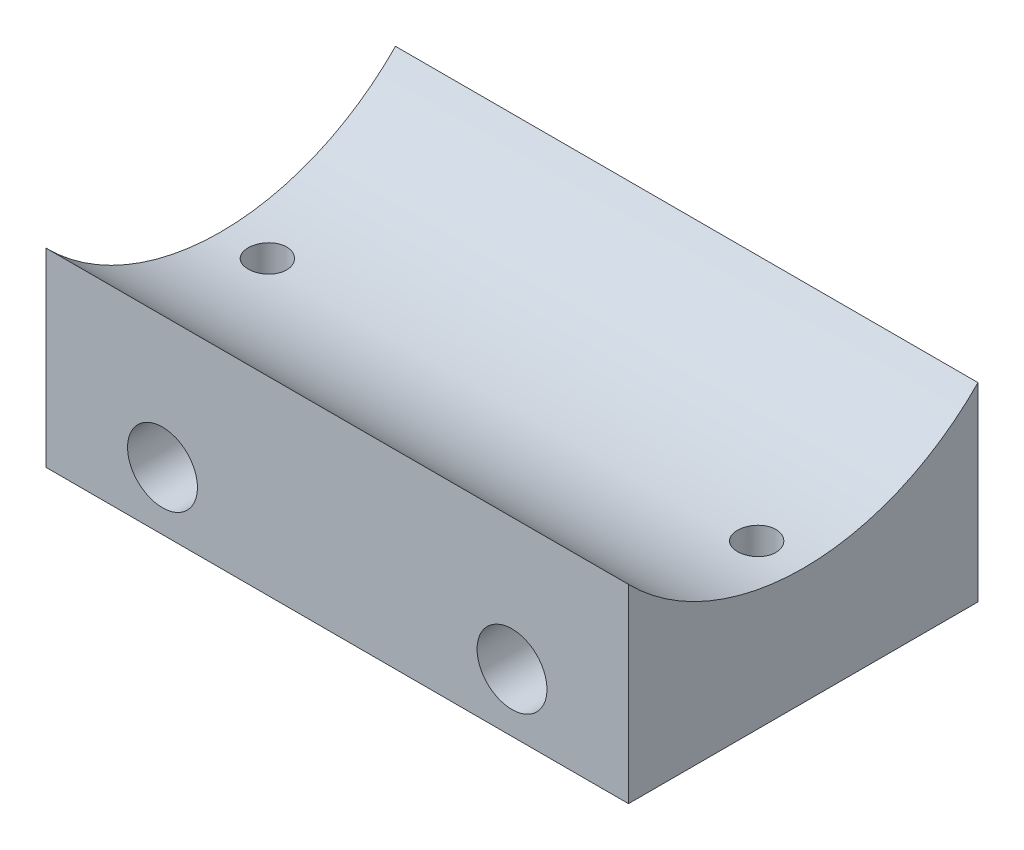
ISO-10303-21;
HEADER;
FILE_DESCRIPTION(('STEP AP214'),'2;1');
FILE_NAME('part.step','',(''),(''),'','','');
FILE_SCHEMA(('AUTOMOTIVE_DESIGN { 1 0 10303 214 1 1 1 1 }'));
ENDSEC;
DATA;
#1=APPLICATION_CONTEXT('core data for automotive mechanical design processes');
#2=APPLICATION_PROTOCOL_DEFINITION('international standard','automotive_design',2000,#1);
#3=PRODUCT_CONTEXT('',#1,'mechanical');
#4=PRODUCT('Part','Part','',(#3));
#5=PRODUCT_RELATED_PRODUCT_CATEGORY('part','',(#4));
#6=PRODUCT_DEFINITION_FORMATION('','',#4);
#7=PRODUCT_DEFINITION_CONTEXT('part definition',#1,'design');
#8=PRODUCT_DEFINITION('design','',#6,#7);
#9=PRODUCT_DEFINITION_SHAPE('','',#8);
#10=(LENGTH_UNIT() NAMED_UNIT(*) SI_UNIT(.MILLI.,.METRE.));
#11=(NAMED_UNIT(*) PLANE_ANGLE_UNIT() SI_UNIT($,.RADIAN.));
#12=(NAMED_UNIT(*) SI_UNIT($,.STERADIAN.) SOLID_ANGLE_UNIT());
#13=UNCERTAINTY_MEASURE_WITH_UNIT(LENGTH_MEASURE(1.E-05),#10,'distance_accuracy_value','');
#14=(GEOMETRIC_REPRESENTATION_CONTEXT(3) GLOBAL_UNCERTAINTY_ASSIGNED_CONTEXT((#13)) GLOBAL_UNIT_ASSIGNED_CONTEXT((#10,
#11,#12)) REPRESENTATION_CONTEXT('',''));
#15=CARTESIAN_POINT('',(0.,0.,0.));
#16=DIRECTION('',(0.,0.,1.));
#17=DIRECTION('',(1.,0.,0.));
#18=AXIS2_PLACEMENT_3D('',#15,#16,#17);
#19=CARTESIAN_POINT('',(25.,0.,0.));
#20=DIRECTION('',(-1.,0.,0.));
#21=DIRECTION('',(0.,0.,1.));
#22=AXIS2_PLACEMENT_3D('',#19,#20,#21);
#23=CYLINDRICAL_SURFACE('',#22,21.);
#24=CARTESIAN_POINT('',(21.,-20.9350782181486,-1.65));
#25=CARTESIAN_POINT('',(21.092527620589,-20.9350790804748,-1.64999595015938));
#26=CARTESIAN_POINT('',(21.1851186888235,-20.9356982423761,-1.64219076832339));
#27=CARTESIAN_POINT('',(21.3677402740258,-20.9381080458335,-1.6111685722603));
#28=CARTESIAN_POINT('',(21.457767747258,-20.9399000239191,-1.58793397438507));
#29=CARTESIAN_POINT('',(21.6325906544194,-20.9444512476889,-1.52672789530202));
#30=CARTESIAN_POINT('',(21.7173889722025,-20.9472099545141,-1.48876462266708));
#31=CARTESIAN_POINT('',(21.8793890719218,-20.9533831215729,-1.39919311205023));
#32=CARTESIAN_POINT('',(21.9565925021115,-20.956797439048,-1.34758784367761));
#33=CARTESIAN_POINT('',(22.1014093366519,-20.9639059365928,-1.23206881275081));
#34=CARTESIAN_POINT('',(22.1690029057444,-20.9676006720389,-1.16813021631683));
#35=CARTESIAN_POINT('',(22.2925110110278,-20.9748485979941,-1.02981182968185));
#36=CARTESIAN_POINT('',(22.3484250429098,-20.9784017823857,-0.955431588854495));
#37=CARTESIAN_POINT('',(22.4470519047894,-20.98497142971,-0.798224206411629));
#38=CARTESIAN_POINT('',(22.4897477170209,-20.987987198647,-0.715386356921386));
#39=CARTESIAN_POINT('',(22.5606172959374,-20.993136258381,-0.543690006024842));
#40=CARTESIAN_POINT('',(22.5887912917029,-20.9952695630986,-0.454831599617383));
#41=CARTESIAN_POINT('',(22.6297607809604,-20.9984094548262,-0.273812753289201));
#42=CARTESIAN_POINT('',(22.6425881758702,-20.9994183788181,-0.181659574702927));
#43=CARTESIAN_POINT('',(22.6525989342303,-21.0002037396088,0.00349698200706647));
#44=CARTESIAN_POINT('',(22.6497825595715,-20.9999801970401,0.096500345871881));
#45=CARTESIAN_POINT('',(22.6286118685276,-20.9983277452348,0.280500999663382));
#46=CARTESIAN_POINT('',(22.6102918591218,-20.9969014974106,0.371502264094971));
#47=CARTESIAN_POINT('',(22.5586872543228,-20.9930071548187,0.549134134574872));
#48=CARTESIAN_POINT('',(22.5254025300191,-20.9905390510762,0.635764702965551));
#49=CARTESIAN_POINT('',(22.4447749348006,-20.9848341359249,0.802305475460377));
#50=CARTESIAN_POINT('',(22.3974166529461,-20.9815964826198,0.882208188639928));
#51=CARTESIAN_POINT('',(22.2899974633615,-20.9747164468645,1.03294333734508));
#52=CARTESIAN_POINT('',(22.2299363270385,-20.9710740571314,1.10377560960763));
#53=CARTESIAN_POINT('',(22.0986228848776,-20.9637824232235,1.23455970810676));
#54=CARTESIAN_POINT('',(22.0273407769955,-20.9601331871228,1.29448161617403));
#55=CARTESIAN_POINT('',(21.8757128267167,-20.9532490794854,1.40151300203242));
#56=CARTESIAN_POINT('',(21.7953669779957,-20.9500142082379,1.44862247088344));
#57=CARTESIAN_POINT('',(21.6278717660801,-20.9443244131598,1.52869032380417));
#58=CARTESIAN_POINT('',(21.54072169324,-20.9418695708179,1.56164722949831));
#59=CARTESIAN_POINT('',(21.3621015928344,-20.9380192769218,1.61245266088563));
#60=CARTESIAN_POINT('',(21.2706316459198,-20.9366238055976,1.63030146852548));
#61=CARTESIAN_POINT('',(21.0862298798524,-20.935053376923,1.65034632000412));
#62=CARTESIAN_POINT('',(20.9933026187116,-20.9348751690487,1.65258405127871));
#63=CARTESIAN_POINT('',(20.8083942408438,-20.9357508610257,1.6414523578236));
#64=CARTESIAN_POINT('',(20.7164131162916,-20.9368047506786,1.62808306227942));
#65=CARTESIAN_POINT('',(20.536127238874,-20.9400229219213,1.58615154219629));
#66=CARTESIAN_POINT('',(20.4478179488327,-20.9421857862653,1.55760870740535));
#67=CARTESIAN_POINT('',(20.2772420963053,-20.9473770176035,1.48616002748657));
#68=CARTESIAN_POINT('',(20.1949756201895,-20.9504053969656,1.44325397711291));
#69=CARTESIAN_POINT('',(20.038629688393,-20.9569943092823,1.34419105953896));
#70=CARTESIAN_POINT('',(19.9645679064715,-20.9605559535998,1.28800637377386));
#71=CARTESIAN_POINT('',(19.8269121815033,-20.9678062873457,1.16402131738203));
#72=CARTESIAN_POINT('',(19.763318398818,-20.9714949787192,1.09622076884203));
#73=CARTESIAN_POINT('',(19.648261946893,-20.9785934150738,0.950748633440791));
#74=CARTESIAN_POINT('',(19.596826335437,-20.9820025270558,0.87305561098602));
#75=CARTESIAN_POINT('',(19.5077318173851,-20.9881485745718,0.710110997307244));
#76=CARTESIAN_POINT('',(19.4700727863163,-20.9908855161788,0.624859474383682));
#77=CARTESIAN_POINT('',(19.4096470521909,-20.9953759070448,0.449315429974508));
#78=CARTESIAN_POINT('',(19.386863517871,-20.9971304675225,0.359028731709084));
#79=CARTESIAN_POINT('',(19.3567804895311,-20.9994628984998,0.175897103788269));
#80=CARTESIAN_POINT('',(19.349480738188,-21.0000407885542,0.083052216673091));
#81=CARTESIAN_POINT('',(19.3505753467611,-20.9999548047818,-0.102293288410042));
#82=CARTESIAN_POINT('',(19.3589274950303,-20.9992942708614,-0.194794160157136));
#83=CARTESIAN_POINT('',(19.3910009164863,-20.9968122788016,-0.377075291494928));
#84=CARTESIAN_POINT('',(19.4147222123587,-20.9949908189486,-0.466855547069666));
#85=CARTESIAN_POINT('',(19.4768501119821,-20.9903914302849,-0.641150493162281));
#86=CARTESIAN_POINT('',(19.5152560898604,-20.9876135422385,-0.725665407914575));
#87=CARTESIAN_POINT('',(19.6056581451845,-20.9814123559867,-0.887054393548722));
#88=CARTESIAN_POINT('',(19.6576539730774,-20.9779890696332,-0.963928604702425));
#89=CARTESIAN_POINT('',(19.7739179507515,-20.970870543098,-1.10806977259647));
#90=CARTESIAN_POINT('',(19.8382172299883,-20.9671746280247,-1.17531158675284));
#91=CARTESIAN_POINT('',(19.9772089400747,-20.959933104619,-1.29807418611794));
#92=CARTESIAN_POINT('',(20.0519038905584,-20.9563875329986,-1.35359212153361));
#93=CARTESIAN_POINT('',(20.2096962375524,-20.9498415279882,-1.45139734770034));
#94=CARTESIAN_POINT('',(20.2928077845514,-20.9468420372016,-1.49366185052016));
#95=CARTESIAN_POINT('',(20.4649135231752,-20.9417394183724,-1.56358260874435));
#96=CARTESIAN_POINT('',(20.5539007848267,-20.939635255424,-1.59125573916057));
#97=CARTESIAN_POINT('',(20.7028484220265,-20.9371053107107,-1.62412338463892));
#98=CARTESIAN_POINT('',(20.7618495402881,-20.9363486205065,-1.63381430598));
#99=CARTESIAN_POINT('',(20.880558292341,-20.9353347964591,-1.64675391337394));
#100=CARTESIAN_POINT('',(20.940265924479,-20.9350776614472,-1.65000261450022));
#101=CARTESIAN_POINT('',(21.,-20.9350782181486,-1.65));
#102=B_SPLINE_CURVE_WITH_KNOTS('',3,(#24,#25,#26,#27,#28,#29,#30,#31,#32,#33,#34,#35,#36,#37,
#38,#39,#40,#41,#42,#43,#44,#45,#46,#47,#48,#49,#50,#51,#52,#53,#54,#55,#56,#57,#58,#59,#60,#61,
#62,#63,#64,#65,#66,#67,#68,#69,#70,#71,#72,#73,#74,#75,#76,#77,#78,#79,#80,#81,#82,#83,#84,#85,
#86,#87,#88,#89,#90,#91,#92,#93,#94,#95,#96,#97,#98,#99,#100,#101),.UNSPECIFIED.,.T.,.F.,(4,2,2,
2,2,2,2,2,2,2,2,2,2,2,2,2,2,2,2,2,2,2,2,2,2,2,2,2,2,2,2,2,2,2,2,2,2,2,4),(0.,0.277364770240659,
0.55504617420005,0.832573042782679,1.11003954859225,1.388070694227,1.66611384244453,
1.9445134821762,2.22290873004054,2.50072425862016,2.7785351363268,3.05573286713319,
3.33293298584947,3.61043777203461,3.88794755245451,4.1662072153425,4.44446707239031,
4.72275598937314,5.00103971282577,5.27858002881023,5.55611804750018,5.83330225934825,
6.11049043224045,6.38826454031513,6.66604290327127,6.94443375596779,7.22282209331334,
7.50089489262229,7.77896307063604,8.05628240491496,8.33360214853093,8.6109100738808,
8.88821290733267,9.16622686184388,9.44430831727274,9.72286531662432,10.0010994525529,
10.1801613023329,10.3592227331462),.UNSPECIFIED.);
#103=CARTESIAN_POINT('',(21.,-20.9350782181486,-1.65));
#104=VERTEX_POINT('',#103);
#105=EDGE_CURVE('E189',#104,#104,#102,.T.);
#106=ORIENTED_EDGE('',*,*,#105,.T.);
#107=EDGE_LOOP('',(#106));
#108=FACE_BOUND('',#107,.T.);
#109=CARTESIAN_POINT('',(-21.,-20.9350782181486,-1.65));
#110=CARTESIAN_POINT('',(-20.907472379411,-20.9350790804748,-1.64999595015938));
#111=CARTESIAN_POINT('',(-20.8148813111765,-20.9356982423761,-1.64219076832339));
#112=CARTESIAN_POINT('',(-20.6322597259742,-20.9381080458335,-1.6111685722603));
#113=CARTESIAN_POINT('',(-20.542232252742,-20.9399000239191,-1.58793397438507));
#114=CARTESIAN_POINT('',(-20.3674093455806,-20.9444512476889,-1.52672789530202));
#115=CARTESIAN_POINT('',(-20.2826110277975,-20.9472099545141,-1.48876462266708));
#116=CARTESIAN_POINT('',(-20.1206109280782,-20.9533831215729,-1.39919311205023));
#117=CARTESIAN_POINT('',(-20.0434074978885,-20.956797439048,-1.34758784367761));
#118=CARTESIAN_POINT('',(-19.8985906633481,-20.9639059365928,-1.23206881275081));
#119=CARTESIAN_POINT('',(-19.8309970942556,-20.9676006720389,-1.16813021631684));
#120=CARTESIAN_POINT('',(-19.7074889889722,-20.9748485979941,-1.02981182968185));
#121=CARTESIAN_POINT('',(-19.6515749570902,-20.9784017823857,-0.955431588854494));
#122=CARTESIAN_POINT('',(-19.5529480952106,-20.98497142971,-0.798224206411629));
#123=CARTESIAN_POINT('',(-19.5102522829791,-20.987987198647,-0.715386356921386));
#124=CARTESIAN_POINT('',(-19.4393827040626,-20.993136258381,-0.543690006024842));
#125=CARTESIAN_POINT('',(-19.4112087082971,-20.9952695630986,-0.454831599617384));
#126=CARTESIAN_POINT('',(-19.3702392190396,-20.9984094548262,-0.273812753289201));
#127=CARTESIAN_POINT('',(-19.3574118241298,-20.9994183788181,-0.181659574702927));
#128=CARTESIAN_POINT('',(-19.3474010657697,-21.0002037396088,0.00349698200706591));
#129=CARTESIAN_POINT('',(-19.3502174404285,-20.9999801970401,0.0965003458718805));
#130=CARTESIAN_POINT('',(-19.3713881314724,-20.9983277452348,0.280500999663382));
#131=CARTESIAN_POINT('',(-19.3897081408782,-20.9969014974106,0.371502264094972));
#132=CARTESIAN_POINT('',(-19.4413127456772,-20.9930071548187,0.549134134574873));
#133=CARTESIAN_POINT('',(-19.474597469981,-20.9905390510762,0.63576470296555));
#134=CARTESIAN_POINT('',(-19.5552250651994,-20.9848341359249,0.802305475460379));
#135=CARTESIAN_POINT('',(-19.602583347054,-20.9815964826198,0.882208188639932));
#136=CARTESIAN_POINT('',(-19.7100025366385,-20.9747164468645,1.03294333734508));
#137=CARTESIAN_POINT('',(-19.7700636729615,-20.9710740571314,1.10377560960763));
#138=CARTESIAN_POINT('',(-19.9013771151224,-20.9637824232235,1.23455970810676));
#139=CARTESIAN_POINT('',(-19.9726592230045,-20.9601331871228,1.29448161617404));
#140=CARTESIAN_POINT('',(-20.1242871732833,-20.9532490794854,1.40151300203242));
#141=CARTESIAN_POINT('',(-20.2046330220043,-20.9500142082379,1.44862247088344));
#142=CARTESIAN_POINT('',(-20.3721282339199,-20.9443244131598,1.52869032380417));
#143=CARTESIAN_POINT('',(-20.45927830676,-20.9418695708179,1.56164722949832));
#144=CARTESIAN_POINT('',(-20.6378984071656,-20.9380192769218,1.61245266088564));
#145=CARTESIAN_POINT('',(-20.7293683540802,-20.9366238055976,1.63030146852548));
#146=CARTESIAN_POINT('',(-20.9137701201476,-20.935053376923,1.65034632000412));
#147=CARTESIAN_POINT('',(-21.0066973812884,-20.9348751690487,1.65258405127871));
#148=CARTESIAN_POINT('',(-21.1916057591562,-20.9357508610257,1.6414523578236));
#149=CARTESIAN_POINT('',(-21.2835868837084,-20.9368047506786,1.62808306227942));
#150=CARTESIAN_POINT('',(-21.463872761126,-20.9400229219213,1.58615154219629));
#151=CARTESIAN_POINT('',(-21.5521820511673,-20.9421857862653,1.55760870740535));
#152=CARTESIAN_POINT('',(-21.7227579036947,-20.9473770176035,1.48616002748657));
#153=CARTESIAN_POINT('',(-21.8050243798105,-20.9504053969656,1.44325397711291));
#154=CARTESIAN_POINT('',(-21.961370311607,-20.9569943092823,1.34419105953896));
#155=CARTESIAN_POINT('',(-22.0354320935285,-20.9605559535998,1.28800637377386));
#156=CARTESIAN_POINT('',(-22.1730878184967,-20.9678062873457,1.16402131738203));
#157=CARTESIAN_POINT('',(-22.236681601182,-20.9714949787192,1.09622076884203));
#158=CARTESIAN_POINT('',(-22.351738053107,-20.9785934150738,0.950748633440791));
#159=CARTESIAN_POINT('',(-22.403173664563,-20.9820025270558,0.873055610986019));
#160=CARTESIAN_POINT('',(-22.492268182615,-20.9881485745718,0.710110997307242));
#161=CARTESIAN_POINT('',(-22.5299272136837,-20.9908855161788,0.624859474383682));
#162=CARTESIAN_POINT('',(-22.5903529478091,-20.9953759070448,0.449315429974508));
#163=CARTESIAN_POINT('',(-22.613136482129,-20.9971304675225,0.359028731709083));
#164=CARTESIAN_POINT('',(-22.6432195104689,-20.9994628984998,0.175897103788267));
#165=CARTESIAN_POINT('',(-22.650519261812,-21.0000407885542,0.0830522166730901));
#166=CARTESIAN_POINT('',(-22.6494246532389,-20.9999548047818,-0.102293288410041));
#167=CARTESIAN_POINT('',(-22.6410725049697,-20.9992942708614,-0.194794160157135));
#168=CARTESIAN_POINT('',(-22.6089990835137,-20.9968122788016,-0.377075291494927));
#169=CARTESIAN_POINT('',(-22.5852777876413,-20.9949908189486,-0.466855547069666));
#170=CARTESIAN_POINT('',(-22.5231498880179,-20.9903914302849,-0.641150493162281));
#171=CARTESIAN_POINT('',(-22.4847439101396,-20.9876135422385,-0.725665407914574));
#172=CARTESIAN_POINT('',(-22.3943418548155,-20.9814123559867,-0.887054393548722));
#173=CARTESIAN_POINT('',(-22.3423460269226,-20.9779890696332,-0.963928604702425));
#174=CARTESIAN_POINT('',(-22.2260820492485,-20.970870543098,-1.10806977259647));
#175=CARTESIAN_POINT('',(-22.1617827700117,-20.9671746280247,-1.17531158675284));
#176=CARTESIAN_POINT('',(-22.0227910599253,-20.959933104619,-1.29807418611793));
#177=CARTESIAN_POINT('',(-21.9480961094416,-20.9563875329986,-1.35359212153361));
#178=CARTESIAN_POINT('',(-21.7903037624476,-20.9498415279882,-1.45139734770034));
#179=CARTESIAN_POINT('',(-21.7071922154486,-20.9468420372016,-1.49366185052016));
#180=CARTESIAN_POINT('',(-21.5350864768248,-20.9417394183724,-1.56358260874435));
#181=CARTESIAN_POINT('',(-21.4460992151733,-20.939635255424,-1.59125573916057));
#182=CARTESIAN_POINT('',(-21.2971515779735,-20.9371053107107,-1.62412338463892));
#183=CARTESIAN_POINT('',(-21.2381504597119,-20.9363486205065,-1.63381430598));
#184=CARTESIAN_POINT('',(-21.119441707659,-20.9353347964591,-1.64675391337394));
#185=CARTESIAN_POINT('',(-21.059734075521,-20.9350776614472,-1.65000261450022));
#186=CARTESIAN_POINT('',(-21.,-20.9350782181486,-1.65));
#187=B_SPLINE_CURVE_WITH_KNOTS('',3,(#109,#110,#111,#112,#113,#114,#115,#116,#117,#118,#119,
#120,#121,#122,#123,#124,#125,#126,#127,#128,#129,#130,#131,#132,#133,#134,#135,#136,#137,#138,
#139,#140,#141,#142,#143,#144,#145,#146,#147,#148,#149,#150,#151,#152,#153,#154,#155,#156,#157,
#158,#159,#160,#161,#162,#163,#164,#165,#166,#167,#168,#169,#170,#171,#172,#173,#174,#175,#176,
#177,#178,#179,#180,#181,#182,#183,#184,#185,#186),.UNSPECIFIED.,.T.,.F.,(4,2,2,2,2,2,2,2,2,2,2,
2,2,2,2,2,2,2,2,2,2,2,2,2,2,2,2,2,2,2,2,2,2,2,2,2,2,2,4),(0.,0.277364770240655,
0.555046174200047,0.832573042782682,1.11003954859225,1.388070694227,1.66611384244453,
1.9445134821762,2.22290873004054,2.50072425862016,2.7785351363268,3.05573286713319,
3.33293298584947,3.61043777203462,3.88794755245452,4.16620721534251,4.44446707239031,
4.72275598937315,5.00103971282577,5.27858002881023,5.55611804750019,5.83330225934825,
6.11049043224045,6.38826454031513,6.66604290327127,6.94443375596779,7.22282209331334,
7.50089489262229,7.77896307063604,8.05628240491496,8.33360214853093,8.6109100738808,
8.88821290733267,9.16622686184387,9.44430831727274,9.72286531662432,10.0010994525529,
10.1801613023329,10.3592227331462),.UNSPECIFIED.);
#188=CARTESIAN_POINT('',(-21.,-20.9350782181486,-1.65));
#189=VERTEX_POINT('',#188);
#190=EDGE_CURVE('E167',#189,#189,#187,.T.);
#191=ORIENTED_EDGE('',*,*,#190,.T.);
#192=EDGE_LOOP('',(#191));
#193=FACE_BOUND('',#192,.T.);
#194=CARTESIAN_POINT('',(-25.,0.,0.));
#195=DIRECTION('',(-1.,0.,0.));
#196=DIRECTION('',(0.,0.,-1.));
#197=AXIS2_PLACEMENT_3D('',#194,#195,#196);
#198=CIRCLE('',#197,21.);
#199=CARTESIAN_POINT('',(-25.,-14.6969384566991,-15.));
#200=VERTEX_POINT('',#199);
#201=CARTESIAN_POINT('',(-25.,-14.6969384566991,15.));
#202=VERTEX_POINT('',#201);
#203=EDGE_CURVE('E132',#200,#202,#198,.T.);
#204=ORIENTED_EDGE('',*,*,#203,.T.);
#205=DIRECTION('',(-1.,0.,0.));
#206=VECTOR('',#205,1.);
#207=CARTESIAN_POINT('',(25.,-14.6969384566991,15.));
#208=LINE('',#207,#206);
#209=CARTESIAN_POINT('',(25.,-14.6969384566991,15.));
#210=VERTEX_POINT('',#209);
#211=EDGE_CURVE('E13',#210,#202,#208,.T.);
#212=ORIENTED_EDGE('',*,*,#211,.F.);
#213=CARTESIAN_POINT('',(25.,0.,0.));
#214=DIRECTION('',(-1.,0.,0.));
#215=DIRECTION('',(0.,0.,-1.));
#216=AXIS2_PLACEMENT_3D('',#213,#214,#215);
#217=CIRCLE('',#216,21.);
#218=CARTESIAN_POINT('',(25.,-14.6969384566991,-15.));
#219=VERTEX_POINT('',#218);
#220=EDGE_CURVE('E114',#219,#210,#217,.T.);
#221=ORIENTED_EDGE('',*,*,#220,.F.);
#222=DIRECTION('',(-1.,0.,0.));
#223=VECTOR('',#222,1.);
#224=CARTESIAN_POINT('',(25.,-14.6969384566991,-15.));
#225=LINE('',#224,#223);
#226=EDGE_CURVE('E128',#219,#200,#225,.T.);
#227=ORIENTED_EDGE('',*,*,#226,.T.);
#228=EDGE_LOOP('',(#204,#212,#221,#227));
#229=FACE_BOUND('',#228,.T.);
#230=ADVANCED_FACE('F54',(#108,#193,#229),#23,.F.);
#231=CARTESIAN_POINT('',(25.,-31.,15.));
#232=DIRECTION('',(0.,0.,-1.));
#233=DIRECTION('',(-1.,0.,0.));
#234=AXIS2_PLACEMENT_3D('',#231,#232,#233);
#235=PLANE('',#234);
#236=CARTESIAN_POINT('',(15.,-26.,15.));
#237=DIRECTION('',(0.,0.,-1.));
#238=DIRECTION('',(-1.,0.,0.));
#239=AXIS2_PLACEMENT_3D('',#236,#237,#238);
#240=CIRCLE('',#239,3.);
#241=CARTESIAN_POINT('',(12.,-26.,15.));
#242=VERTEX_POINT('',#241);
#243=EDGE_CURVE('E160',#242,#242,#240,.T.);
#244=ORIENTED_EDGE('',*,*,#243,.T.);
#245=EDGE_LOOP('',(#244));
#246=FACE_BOUND('',#245,.T.);
#247=CARTESIAN_POINT('',(-15.,-26.,15.));
#248=DIRECTION('',(0.,0.,-1.));
#249=DIRECTION('',(-1.,0.,0.));
#250=AXIS2_PLACEMENT_3D('',#247,#248,#249);
#251=CIRCLE('',#250,3.);
#252=CARTESIAN_POINT('',(-18.,-26.,15.));
#253=VERTEX_POINT('',#252);
#254=EDGE_CURVE('E136',#253,#253,#251,.T.);
#255=ORIENTED_EDGE('',*,*,#254,.T.);
#256=EDGE_LOOP('',(#255));
#257=FACE_BOUND('',#256,.T.);
#258=DIRECTION('',(0.,-1.,0.));
#259=VECTOR('',#258,1.);
#260=CARTESIAN_POINT('',(-25.,-31.,15.));
#261=LINE('',#260,#259);
#262=CARTESIAN_POINT('',(-25.,-31.,15.));
#263=VERTEX_POINT('',#262);
#264=EDGE_CURVE('E119',#202,#263,#261,.T.);
#265=ORIENTED_EDGE('',*,*,#264,.T.);
#266=DIRECTION('',(-1.,0.,0.));
#267=VECTOR('',#266,1.);
#268=CARTESIAN_POINT('',(25.,-31.,15.));
#269=LINE('',#268,#267);
#270=CARTESIAN_POINT('',(25.,-31.,15.));
#271=VERTEX_POINT('',#270);
#272=EDGE_CURVE('E63',#271,#263,#269,.T.);
#273=ORIENTED_EDGE('',*,*,#272,.F.);
#274=DIRECTION('',(0.,-1.,0.));
#275=VECTOR('',#274,1.);
#276=CARTESIAN_POINT('',(25.,-31.,15.));
#277=LINE('',#276,#275);
#278=EDGE_CURVE('E108',#210,#271,#277,.T.);
#279=ORIENTED_EDGE('',*,*,#278,.F.);
#280=ORIENTED_EDGE('',*,*,#211,.T.);
#281=EDGE_LOOP('',(#265,#273,#279,#280));
#282=FACE_BOUND('',#281,.T.);
#283=ADVANCED_FACE('F118',(#246,#257,#282),#235,.F.);
#284=CARTESIAN_POINT('',(25.,-31.,15.));
#285=DIRECTION('',(0.,1.,0.));
#286=DIRECTION('',(0.,0.,1.));
#287=AXIS2_PLACEMENT_3D('',#284,#285,#286);
#288=PLANE('',#287);
#289=CARTESIAN_POINT('',(21.,-31.,0.));
#290=DIRECTION('',(0.,-1.,0.));
#291=DIRECTION('',(0.,0.,-1.));
#292=AXIS2_PLACEMENT_3D('',#289,#290,#291);
#293=CIRCLE('',#292,1.65);
#294=CARTESIAN_POINT('',(21.,-31.,-1.65));
#295=VERTEX_POINT('',#294);
#296=EDGE_CURVE('E195',#295,#295,#293,.T.);
#297=ORIENTED_EDGE('',*,*,#296,.F.);
#298=EDGE_LOOP('',(#297));
#299=FACE_BOUND('',#298,.T.);
#300=CARTESIAN_POINT('',(-21.,-31.,0.));
#301=DIRECTION('',(0.,-1.,0.));
#302=DIRECTION('',(0.,0.,-1.));
#303=AXIS2_PLACEMENT_3D('',#300,#301,#302);
#304=CIRCLE('',#303,1.65);
#305=CARTESIAN_POINT('',(-21.,-31.,-1.65));
#306=VERTEX_POINT('',#305);
#307=EDGE_CURVE('E175',#306,#306,#304,.T.);
#308=ORIENTED_EDGE('',*,*,#307,.F.);
#309=EDGE_LOOP('',(#308));
#310=FACE_BOUND('',#309,.T.);
#311=DIRECTION('',(0.,0.,-1.));
#312=VECTOR('',#311,1.);
#313=CARTESIAN_POINT('',(-25.,-31.,15.));
#314=LINE('',#313,#312);
#315=CARTESIAN_POINT('',(-25.,-31.,-15.));
#316=VERTEX_POINT('',#315);
#317=EDGE_CURVE('E95',#263,#316,#314,.T.);
#318=ORIENTED_EDGE('',*,*,#317,.T.);
#319=DIRECTION('',(-1.,0.,0.));
#320=VECTOR('',#319,1.);
#321=CARTESIAN_POINT('',(25.,-31.,-15.));
#322=LINE('',#321,#320);
#323=CARTESIAN_POINT('',(25.,-31.,-15.));
#324=VERTEX_POINT('',#323);
#325=EDGE_CURVE('E121',#324,#316,#322,.T.);
#326=ORIENTED_EDGE('',*,*,#325,.F.);
#327=DIRECTION('',(0.,0.,-1.));
#328=VECTOR('',#327,1.);
#329=CARTESIAN_POINT('',(25.,-31.,15.));
#330=LINE('',#329,#328);
#331=EDGE_CURVE('E112',#271,#324,#330,.T.);
#332=ORIENTED_EDGE('',*,*,#331,.F.);
#333=ORIENTED_EDGE('',*,*,#272,.T.);
#334=EDGE_LOOP('',(#318,#326,#332,#333));
#335=FACE_BOUND('',#334,.T.);
#336=ADVANCED_FACE('F122',(#299,#310,#335),#288,.F.);
#337=CARTESIAN_POINT('',(25.,-31.,-15.));
#338=DIRECTION('',(0.,0.,1.));
#339=DIRECTION('',(1.,0.,0.));
#340=AXIS2_PLACEMENT_3D('',#337,#338,#339);
#341=PLANE('',#340);
#342=CARTESIAN_POINT('',(15.,-26.,-15.));
#343=DIRECTION('',(0.,0.,-1.));
#344=DIRECTION('',(-1.,0.,0.));
#345=AXIS2_PLACEMENT_3D('',#342,#343,#344);
#346=CIRCLE('',#345,3.);
#347=CARTESIAN_POINT('',(12.,-26.,-15.));
#348=VERTEX_POINT('',#347);
#349=EDGE_CURVE('E163',#348,#348,#346,.T.);
#350=ORIENTED_EDGE('',*,*,#349,.F.);
#351=EDGE_LOOP('',(#350));
#352=FACE_BOUND('',#351,.T.);
#353=CARTESIAN_POINT('',(-15.,-26.,-15.));
#354=DIRECTION('',(0.,0.,-1.));
#355=DIRECTION('',(-1.,0.,0.));
#356=AXIS2_PLACEMENT_3D('',#353,#354,#355);
#357=CIRCLE('',#356,3.);
#358=CARTESIAN_POINT('',(-18.,-26.,-15.));
#359=VERTEX_POINT('',#358);
#360=EDGE_CURVE('E156',#359,#359,#357,.T.);
#361=ORIENTED_EDGE('',*,*,#360,.F.);
#362=EDGE_LOOP('',(#361));
#363=FACE_BOUND('',#362,.T.);
#364=DIRECTION('',(0.,1.,0.));
#365=VECTOR('',#364,1.);
#366=CARTESIAN_POINT('',(-25.,-31.,-15.));
#367=LINE('',#366,#365);
#368=EDGE_CURVE('E101',#316,#200,#367,.T.);
#369=ORIENTED_EDGE('',*,*,#368,.T.);
#370=ORIENTED_EDGE('',*,*,#226,.F.);
#371=DIRECTION('',(0.,1.,0.));
#372=VECTOR('',#371,1.);
#373=CARTESIAN_POINT('',(25.,-31.,-15.));
#374=LINE('',#373,#372);
#375=EDGE_CURVE('E74',#324,#219,#374,.T.);
#376=ORIENTED_EDGE('',*,*,#375,.F.);
#377=ORIENTED_EDGE('',*,*,#325,.T.);
#378=EDGE_LOOP('',(#369,#370,#376,#377));
#379=FACE_BOUND('',#378,.T.);
#380=ADVANCED_FACE('F148',(#352,#363,#379),#341,.F.);
#381=CARTESIAN_POINT('',(25.,0.,0.));
#382=DIRECTION('',(1.,0.,0.));
#383=DIRECTION('',(0.,0.,-1.));
#384=AXIS2_PLACEMENT_3D('',#381,#382,#383);
#385=PLANE('',#384);
#386=ORIENTED_EDGE('',*,*,#220,.T.);
#387=ORIENTED_EDGE('',*,*,#278,.T.);
#388=ORIENTED_EDGE('',*,*,#331,.T.);
#389=ORIENTED_EDGE('',*,*,#375,.T.);
#390=EDGE_LOOP('',(#386,#387,#388,#389));
#391=FACE_BOUND('',#390,.T.);
#392=ADVANCED_FACE('F110',(#391),#385,.T.);
#393=CARTESIAN_POINT('',(-25.,0.,0.));
#394=DIRECTION('',(1.,0.,0.));
#395=DIRECTION('',(0.,0.,-1.));
#396=AXIS2_PLACEMENT_3D('',#393,#394,#395);
#397=PLANE('',#396);
#398=ORIENTED_EDGE('',*,*,#203,.F.);
#399=ORIENTED_EDGE('',*,*,#368,.F.);
#400=ORIENTED_EDGE('',*,*,#317,.F.);
#401=ORIENTED_EDGE('',*,*,#264,.F.);
#402=EDGE_LOOP('',(#398,#399,#400,#401));
#403=FACE_BOUND('',#402,.T.);
#404=ADVANCED_FACE('F151',(#403),#397,.F.);
#405=CARTESIAN_POINT('',(-15.,-26.,-15.));
#406=DIRECTION('',(0.,0.,-1.));
#407=DIRECTION('',(-1.,0.,0.));
#408=AXIS2_PLACEMENT_3D('',#405,#406,#407);
#409=CYLINDRICAL_SURFACE('',#408,3.);
#410=ORIENTED_EDGE('',*,*,#254,.F.);
#411=EDGE_LOOP('',(#410));
#412=FACE_BOUND('',#411,.T.);
#413=ORIENTED_EDGE('',*,*,#360,.T.);
#414=EDGE_LOOP('',(#413));
#415=FACE_BOUND('',#414,.T.);
#416=ADVANCED_FACE('F235',(#412,#415),#409,.F.);
#417=CARTESIAN_POINT('',(15.,-26.,-15.));
#418=DIRECTION('',(0.,0.,-1.));
#419=DIRECTION('',(-1.,0.,0.));
#420=AXIS2_PLACEMENT_3D('',#417,#418,#419);
#421=CYLINDRICAL_SURFACE('',#420,3.);
#422=ORIENTED_EDGE('',*,*,#243,.F.);
#423=EDGE_LOOP('',(#422));
#424=FACE_BOUND('',#423,.T.);
#425=ORIENTED_EDGE('',*,*,#349,.T.);
#426=EDGE_LOOP('',(#425));
#427=FACE_BOUND('',#426,.T.);
#428=ADVANCED_FACE('F184',(#424,#427),#421,.F.);
#429=CARTESIAN_POINT('',(-21.,-31.,0.));
#430=DIRECTION('',(0.,-1.,0.));
#431=DIRECTION('',(0.,0.,-1.));
#432=AXIS2_PLACEMENT_3D('',#429,#430,#431);
#433=CYLINDRICAL_SURFACE('',#432,1.65);
#434=ORIENTED_EDGE('',*,*,#190,.F.);
#435=EDGE_LOOP('',(#434));
#436=FACE_BOUND('',#435,.T.);
#437=ORIENTED_EDGE('',*,*,#307,.T.);
#438=EDGE_LOOP('',(#437));
#439=FACE_BOUND('',#438,.T.);
#440=ADVANCED_FACE('F179',(#436,#439),#433,.F.);
#441=CARTESIAN_POINT('',(21.,-31.,0.));
#442=DIRECTION('',(0.,-1.,0.));
#443=DIRECTION('',(0.,0.,-1.));
#444=AXIS2_PLACEMENT_3D('',#441,#442,#443);
#445=CYLINDRICAL_SURFACE('',#444,1.65);
#446=ORIENTED_EDGE('',*,*,#105,.F.);
#447=EDGE_LOOP('',(#446));
#448=FACE_BOUND('',#447,.T.);
#449=ORIENTED_EDGE('',*,*,#296,.T.);
#450=EDGE_LOOP('',(#449));
#451=FACE_BOUND('',#450,.T.);
#452=ADVANCED_FACE('F183',(#448,#451),#445,.F.);
#453=CLOSED_SHELL('',(#230,#283,#336,#380,#392,#404,#416,#428,#440,#452));
#454=MANIFOLD_SOLID_BREP('B2',#453);
#455=ADVANCED_BREP_SHAPE_REPRESENTATION('',(#18,#454),#14);
#456=SHAPE_DEFINITION_REPRESENTATION(#9,#455);
ENDSEC;
END-ISO-10303-21;
